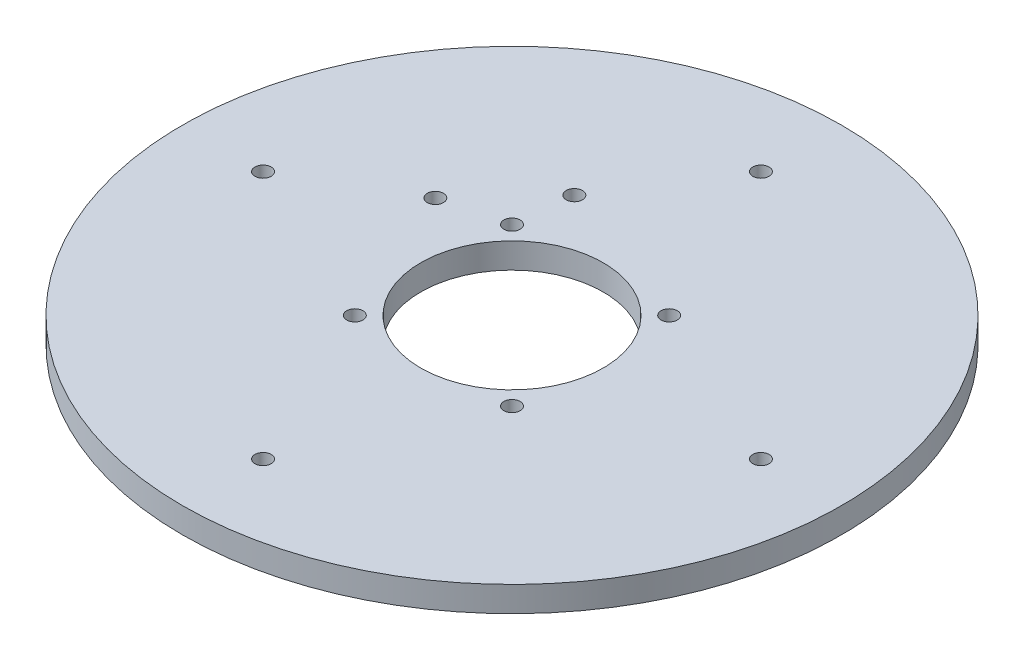
ISO-10303-21;
HEADER;
FILE_DESCRIPTION(('STEP AP214'),'2;1');
FILE_NAME('part.step','',(''),(''),'','','');
FILE_SCHEMA(('AUTOMOTIVE_DESIGN { 1 0 10303 214 1 1 1 1 }'));
ENDSEC;
DATA;
#1=APPLICATION_CONTEXT('core data for automotive mechanical design processes');
#2=APPLICATION_PROTOCOL_DEFINITION('international standard','automotive_design',2000,#1);
#3=PRODUCT_CONTEXT('',#1,'mechanical');
#4=PRODUCT('Part','Part','',(#3));
#5=PRODUCT_RELATED_PRODUCT_CATEGORY('part','',(#4));
#6=PRODUCT_DEFINITION_FORMATION('','',#4);
#7=PRODUCT_DEFINITION_CONTEXT('part definition',#1,'design');
#8=PRODUCT_DEFINITION('design','',#6,#7);
#9=PRODUCT_DEFINITION_SHAPE('','',#8);
#10=(LENGTH_UNIT() NAMED_UNIT(*) SI_UNIT(.MILLI.,.METRE.));
#11=(NAMED_UNIT(*) PLANE_ANGLE_UNIT() SI_UNIT($,.RADIAN.));
#12=(NAMED_UNIT(*) SI_UNIT($,.STERADIAN.) SOLID_ANGLE_UNIT());
#13=UNCERTAINTY_MEASURE_WITH_UNIT(LENGTH_MEASURE(1.E-05),#10,'distance_accuracy_value','');
#14=(GEOMETRIC_REPRESENTATION_CONTEXT(3) GLOBAL_UNCERTAINTY_ASSIGNED_CONTEXT((#13)) GLOBAL_UNIT_ASSIGNED_CONTEXT((#10,
#11,#12)) REPRESENTATION_CONTEXT('',''));
#15=CARTESIAN_POINT('',(0.,0.,0.));
#16=DIRECTION('',(0.,0.,1.));
#17=DIRECTION('',(1.,0.,0.));
#18=AXIS2_PLACEMENT_3D('',#15,#16,#17);
#19=CARTESIAN_POINT('',(0.,5.,0.));
#20=DIRECTION('',(0.,-1.,0.));
#21=DIRECTION('',(0.,0.,-1.));
#22=AXIS2_PLACEMENT_3D('',#19,#20,#21);
#23=PLANE('',#22);
#24=CARTESIAN_POINT('',(-27.6166430453761,5.,-12.496829296618));
#25=DIRECTION('',(0.,1.,0.));
#26=DIRECTION('',(0.,0.,1.));
#27=AXIS2_PLACEMENT_3D('',#24,#25,#26);
#28=CIRCLE('',#27,1.6);
#29=CARTESIAN_POINT('',(-27.6166430453761,5.,-10.896829296618));
#30=VERTEX_POINT('',#29);
#31=EDGE_CURVE('E140',#30,#30,#28,.T.);
#32=ORIENTED_EDGE('',*,*,#31,.F.);
#33=EDGE_LOOP('',(#32));
#34=FACE_BOUND('',#33,.T.);
#35=CARTESIAN_POINT('',(-14.3833569546239,5.,-26.6827427053592));
#36=DIRECTION('',(0.,1.,0.));
#37=DIRECTION('',(0.,0.,1.));
#38=AXIS2_PLACEMENT_3D('',#35,#36,#37);
#39=CIRCLE('',#38,1.6);
#40=CARTESIAN_POINT('',(-14.3833569546239,5.,-25.0827427053592));
#41=VERTEX_POINT('',#40);
#42=EDGE_CURVE('E136',#41,#41,#39,.T.);
#43=ORIENTED_EDGE('',*,*,#42,.F.);
#44=EDGE_LOOP('',(#43));
#45=FACE_BOUND('',#44,.T.);
#46=CARTESIAN_POINT('',(15.5,5.,15.5));
#47=DIRECTION('',(0.,1.,0.));
#48=DIRECTION('',(0.,0.,1.));
#49=AXIS2_PLACEMENT_3D('',#46,#47,#48);
#50=CIRCLE('',#49,1.6);
#51=CARTESIAN_POINT('',(15.5,5.,17.1));
#52=VERTEX_POINT('',#51);
#53=EDGE_CURVE('E72',#52,#52,#50,.T.);
#54=ORIENTED_EDGE('',*,*,#53,.F.);
#55=EDGE_LOOP('',(#54));
#56=FACE_BOUND('',#55,.T.);
#57=CARTESIAN_POINT('',(15.5,5.,-15.5));
#58=DIRECTION('',(0.,1.,0.));
#59=DIRECTION('',(0.,0.,1.));
#60=AXIS2_PLACEMENT_3D('',#57,#58,#59);
#61=CIRCLE('',#60,1.6);
#62=CARTESIAN_POINT('',(15.5,5.,-13.9));
#63=VERTEX_POINT('',#62);
#64=EDGE_CURVE('E81',#63,#63,#61,.T.);
#65=ORIENTED_EDGE('',*,*,#64,.F.);
#66=EDGE_LOOP('',(#65));
#67=FACE_BOUND('',#66,.T.);
#68=CARTESIAN_POINT('',(-15.5,5.,-15.5));
#69=DIRECTION('',(0.,1.,0.));
#70=DIRECTION('',(0.,0.,1.));
#71=AXIS2_PLACEMENT_3D('',#68,#69,#70);
#72=CIRCLE('',#71,1.6);
#73=CARTESIAN_POINT('',(-15.5,5.,-13.9));
#74=VERTEX_POINT('',#73);
#75=EDGE_CURVE('E64',#74,#74,#72,.T.);
#76=ORIENTED_EDGE('',*,*,#75,.F.);
#77=EDGE_LOOP('',(#76));
#78=FACE_BOUND('',#77,.T.);
#79=CARTESIAN_POINT('',(-15.5,5.,15.5));
#80=DIRECTION('',(0.,1.,0.));
#81=DIRECTION('',(0.,0.,1.));
#82=AXIS2_PLACEMENT_3D('',#79,#80,#81);
#83=CIRCLE('',#82,1.6);
#84=CARTESIAN_POINT('',(-15.5,5.,17.1));
#85=VERTEX_POINT('',#84);
#86=EDGE_CURVE('E60',#85,#85,#83,.T.);
#87=ORIENTED_EDGE('',*,*,#86,.F.);
#88=EDGE_LOOP('',(#87));
#89=FACE_BOUND('',#88,.T.);
#90=CARTESIAN_POINT('',(0.,5.,0.));
#91=DIRECTION('',(0.,1.,0.));
#92=DIRECTION('',(0.,0.,1.));
#93=AXIS2_PLACEMENT_3D('',#90,#91,#92);
#94=CIRCLE('',#93,18.);
#95=CARTESIAN_POINT('',(0.,5.,18.));
#96=VERTEX_POINT('',#95);
#97=EDGE_CURVE('E10',#96,#96,#94,.T.);
#98=ORIENTED_EDGE('',*,*,#97,.F.);
#99=EDGE_LOOP('',(#98));
#100=FACE_BOUND('',#99,.T.);
#101=CARTESIAN_POINT('',(-49.1,5.,0.));
#102=DIRECTION('',(0.,1.,0.));
#103=DIRECTION('',(0.,0.,1.));
#104=AXIS2_PLACEMENT_3D('',#101,#102,#103);
#105=CIRCLE('',#104,1.6);
#106=CARTESIAN_POINT('',(-49.1,5.,1.6));
#107=VERTEX_POINT('',#106);
#108=EDGE_CURVE('E109',#107,#107,#105,.T.);
#109=ORIENTED_EDGE('',*,*,#108,.F.);
#110=EDGE_LOOP('',(#109));
#111=FACE_BOUND('',#110,.T.);
#112=CARTESIAN_POINT('',(0.,5.,49.1));
#113=DIRECTION('',(0.,1.,0.));
#114=DIRECTION('',(0.,0.,1.));
#115=AXIS2_PLACEMENT_3D('',#112,#113,#114);
#116=CIRCLE('',#115,1.6);
#117=CARTESIAN_POINT('',(0.,5.,50.7));
#118=VERTEX_POINT('',#117);
#119=EDGE_CURVE('E105',#118,#118,#116,.T.);
#120=ORIENTED_EDGE('',*,*,#119,.F.);
#121=EDGE_LOOP('',(#120));
#122=FACE_BOUND('',#121,.T.);
#123=CARTESIAN_POINT('',(49.1,5.,0.));
#124=DIRECTION('',(0.,1.,0.));
#125=DIRECTION('',(0.,0.,1.));
#126=AXIS2_PLACEMENT_3D('',#123,#124,#125);
#127=CIRCLE('',#126,1.6);
#128=CARTESIAN_POINT('',(49.1,5.,1.6));
#129=VERTEX_POINT('',#128);
#130=EDGE_CURVE('E101',#129,#129,#127,.T.);
#131=ORIENTED_EDGE('',*,*,#130,.F.);
#132=EDGE_LOOP('',(#131));
#133=FACE_BOUND('',#132,.T.);
#134=CARTESIAN_POINT('',(0.,5.,-49.1));
#135=DIRECTION('',(0.,1.,0.));
#136=DIRECTION('',(0.,0.,1.));
#137=AXIS2_PLACEMENT_3D('',#134,#135,#136);
#138=CIRCLE('',#137,1.6);
#139=CARTESIAN_POINT('',(0.,5.,-47.5));
#140=VERTEX_POINT('',#139);
#141=EDGE_CURVE('E97',#140,#140,#138,.T.);
#142=ORIENTED_EDGE('',*,*,#141,.F.);
#143=EDGE_LOOP('',(#142));
#144=FACE_BOUND('',#143,.T.);
#145=CARTESIAN_POINT('',(0.,5.,0.));
#146=DIRECTION('',(0.,1.,0.));
#147=DIRECTION('',(0.,0.,1.));
#148=AXIS2_PLACEMENT_3D('',#145,#146,#147);
#149=CIRCLE('',#148,65.);
#150=CARTESIAN_POINT('',(0.,5.,65.));
#151=VERTEX_POINT('',#150);
#152=EDGE_CURVE('E92',#151,#151,#149,.T.);
#153=ORIENTED_EDGE('',*,*,#152,.T.);
#154=EDGE_LOOP('',(#153));
#155=FACE_BOUND('',#154,.T.);
#156=ADVANCED_FACE('F45',(#34,#45,#56,#67,#78,#89,#100,#111,#122,#133,#144,#155),#23,.F.);
#157=CARTESIAN_POINT('',(0.,0.,0.));
#158=DIRECTION('',(0.,-1.,0.));
#159=DIRECTION('',(0.,0.,-1.));
#160=AXIS2_PLACEMENT_3D('',#157,#158,#159);
#161=PLANE('',#160);
#162=CARTESIAN_POINT('',(-27.6166430453761,0.,-12.496829296618));
#163=DIRECTION('',(0.,1.,0.));
#164=DIRECTION('',(0.,0.,1.));
#165=AXIS2_PLACEMENT_3D('',#162,#163,#164);
#166=CIRCLE('',#165,1.6);
#167=CARTESIAN_POINT('',(-27.6166430453761,0.,-10.896829296618));
#168=VERTEX_POINT('',#167);
#169=EDGE_CURVE('E113',#168,#168,#166,.T.);
#170=ORIENTED_EDGE('',*,*,#169,.T.);
#171=EDGE_LOOP('',(#170));
#172=FACE_BOUND('',#171,.T.);
#173=CARTESIAN_POINT('',(-14.3833569546239,0.,-26.6827427053592));
#174=DIRECTION('',(0.,1.,0.));
#175=DIRECTION('',(0.,0.,1.));
#176=AXIS2_PLACEMENT_3D('',#173,#174,#175);
#177=CIRCLE('',#176,1.6);
#178=CARTESIAN_POINT('',(-14.3833569546239,0.,-25.0827427053592));
#179=VERTEX_POINT('',#178);
#180=EDGE_CURVE('E132',#179,#179,#177,.T.);
#181=ORIENTED_EDGE('',*,*,#180,.T.);
#182=EDGE_LOOP('',(#181));
#183=FACE_BOUND('',#182,.T.);
#184=CARTESIAN_POINT('',(15.5,0.,15.5));
#185=DIRECTION('',(0.,1.,0.));
#186=DIRECTION('',(0.,0.,1.));
#187=AXIS2_PLACEMENT_3D('',#184,#185,#186);
#188=CIRCLE('',#187,1.6);
#189=CARTESIAN_POINT('',(15.5,0.,17.1));
#190=VERTEX_POINT('',#189);
#191=EDGE_CURVE('E68',#190,#190,#188,.T.);
#192=ORIENTED_EDGE('',*,*,#191,.T.);
#193=EDGE_LOOP('',(#192));
#194=FACE_BOUND('',#193,.T.);
#195=CARTESIAN_POINT('',(15.5,0.,-15.5));
#196=DIRECTION('',(0.,1.,0.));
#197=DIRECTION('',(0.,0.,1.));
#198=AXIS2_PLACEMENT_3D('',#195,#196,#197);
#199=CIRCLE('',#198,1.6);
#200=CARTESIAN_POINT('',(15.5,0.,-13.9));
#201=VERTEX_POINT('',#200);
#202=EDGE_CURVE('E77',#201,#201,#199,.T.);
#203=ORIENTED_EDGE('',*,*,#202,.T.);
#204=EDGE_LOOP('',(#203));
#205=FACE_BOUND('',#204,.T.);
#206=CARTESIAN_POINT('',(-15.5,0.,-15.5));
#207=DIRECTION('',(0.,1.,0.));
#208=DIRECTION('',(0.,0.,1.));
#209=AXIS2_PLACEMENT_3D('',#206,#207,#208);
#210=CIRCLE('',#209,1.6);
#211=CARTESIAN_POINT('',(-15.5,0.,-13.9));
#212=VERTEX_POINT('',#211);
#213=EDGE_CURVE('E85',#212,#212,#210,.T.);
#214=ORIENTED_EDGE('',*,*,#213,.T.);
#215=EDGE_LOOP('',(#214));
#216=FACE_BOUND('',#215,.T.);
#217=CARTESIAN_POINT('',(-15.5,0.,15.5));
#218=DIRECTION('',(0.,1.,0.));
#219=DIRECTION('',(0.,0.,1.));
#220=AXIS2_PLACEMENT_3D('',#217,#218,#219);
#221=CIRCLE('',#220,1.6);
#222=CARTESIAN_POINT('',(-15.5,0.,17.1));
#223=VERTEX_POINT('',#222);
#224=EDGE_CURVE('E58',#223,#223,#221,.T.);
#225=ORIENTED_EDGE('',*,*,#224,.T.);
#226=EDGE_LOOP('',(#225));
#227=FACE_BOUND('',#226,.T.);
#228=CARTESIAN_POINT('',(0.,0.,0.));
#229=DIRECTION('',(0.,1.,0.));
#230=DIRECTION('',(0.,0.,1.));
#231=AXIS2_PLACEMENT_3D('',#228,#229,#230);
#232=CIRCLE('',#231,18.);
#233=CARTESIAN_POINT('',(0.,0.,18.));
#234=VERTEX_POINT('',#233);
#235=EDGE_CURVE('E49',#234,#234,#232,.T.);
#236=ORIENTED_EDGE('',*,*,#235,.T.);
#237=EDGE_LOOP('',(#236));
#238=FACE_BOUND('',#237,.T.);
#239=CARTESIAN_POINT('',(-49.1,0.,0.));
#240=DIRECTION('',(0.,1.,0.));
#241=DIRECTION('',(0.,0.,1.));
#242=AXIS2_PLACEMENT_3D('',#239,#240,#241);
#243=CIRCLE('',#242,1.6);
#244=CARTESIAN_POINT('',(-49.1,0.,1.6));
#245=VERTEX_POINT('',#244);
#246=EDGE_CURVE('E96',#245,#245,#243,.T.);
#247=ORIENTED_EDGE('',*,*,#246,.T.);
#248=EDGE_LOOP('',(#247));
#249=FACE_BOUND('',#248,.T.);
#250=CARTESIAN_POINT('',(0.,0.,49.1));
#251=DIRECTION('',(0.,1.,0.));
#252=DIRECTION('',(0.,0.,1.));
#253=AXIS2_PLACEMENT_3D('',#250,#251,#252);
#254=CIRCLE('',#253,1.6);
#255=CARTESIAN_POINT('',(0.,0.,50.7));
#256=VERTEX_POINT('',#255);
#257=EDGE_CURVE('E125',#256,#256,#254,.T.);
#258=ORIENTED_EDGE('',*,*,#257,.T.);
#259=EDGE_LOOP('',(#258));
#260=FACE_BOUND('',#259,.T.);
#261=CARTESIAN_POINT('',(49.1,0.,0.));
#262=DIRECTION('',(0.,1.,0.));
#263=DIRECTION('',(0.,0.,1.));
#264=AXIS2_PLACEMENT_3D('',#261,#262,#263);
#265=CIRCLE('',#264,1.6);
#266=CARTESIAN_POINT('',(49.1,0.,1.6));
#267=VERTEX_POINT('',#266);
#268=EDGE_CURVE('E121',#267,#267,#265,.T.);
#269=ORIENTED_EDGE('',*,*,#268,.T.);
#270=EDGE_LOOP('',(#269));
#271=FACE_BOUND('',#270,.T.);
#272=CARTESIAN_POINT('',(0.,0.,-49.1));
#273=DIRECTION('',(0.,1.,0.));
#274=DIRECTION('',(0.,0.,1.));
#275=AXIS2_PLACEMENT_3D('',#272,#273,#274);
#276=CIRCLE('',#275,1.6);
#277=CARTESIAN_POINT('',(0.,0.,-47.5));
#278=VERTEX_POINT('',#277);
#279=EDGE_CURVE('E117',#278,#278,#276,.T.);
#280=ORIENTED_EDGE('',*,*,#279,.T.);
#281=EDGE_LOOP('',(#280));
#282=FACE_BOUND('',#281,.T.);
#283=CARTESIAN_POINT('',(0.,0.,0.));
#284=DIRECTION('',(0.,1.,0.));
#285=DIRECTION('',(0.,0.,1.));
#286=AXIS2_PLACEMENT_3D('',#283,#284,#285);
#287=CIRCLE('',#286,65.);
#288=CARTESIAN_POINT('',(0.,0.,65.));
#289=VERTEX_POINT('',#288);
#290=EDGE_CURVE('E73',#289,#289,#287,.T.);
#291=ORIENTED_EDGE('',*,*,#290,.F.);
#292=EDGE_LOOP('',(#291));
#293=FACE_BOUND('',#292,.T.);
#294=ADVANCED_FACE('F47',(#172,#183,#194,#205,#216,#227,#238,#249,#260,#271,#282,#293),#161,.T.);
#295=CARTESIAN_POINT('',(0.,5.,0.));
#296=DIRECTION('',(0.,-1.,0.));
#297=DIRECTION('',(0.,0.,-1.));
#298=AXIS2_PLACEMENT_3D('',#295,#296,#297);
#299=CYLINDRICAL_SURFACE('',#298,18.);
#300=ORIENTED_EDGE('',*,*,#97,.T.);
#301=EDGE_LOOP('',(#300));
#302=FACE_BOUND('',#301,.T.);
#303=ORIENTED_EDGE('',*,*,#235,.F.);
#304=EDGE_LOOP('',(#303));
#305=FACE_BOUND('',#304,.T.);
#306=ADVANCED_FACE('F221',(#302,#305),#299,.F.);
#307=CARTESIAN_POINT('',(-15.5,0.,15.5));
#308=DIRECTION('',(0.,1.,0.));
#309=DIRECTION('',(0.,0.,1.));
#310=AXIS2_PLACEMENT_3D('',#307,#308,#309);
#311=CYLINDRICAL_SURFACE('',#310,1.6);
#312=ORIENTED_EDGE('',*,*,#224,.F.);
#313=EDGE_LOOP('',(#312));
#314=FACE_BOUND('',#313,.T.);
#315=ORIENTED_EDGE('',*,*,#86,.T.);
#316=EDGE_LOOP('',(#315));
#317=FACE_BOUND('',#316,.T.);
#318=ADVANCED_FACE('F211',(#314,#317),#311,.F.);
#319=CARTESIAN_POINT('',(-15.5,0.,-15.5));
#320=DIRECTION('',(0.,1.,0.));
#321=DIRECTION('',(0.,0.,1.));
#322=AXIS2_PLACEMENT_3D('',#319,#320,#321);
#323=CYLINDRICAL_SURFACE('',#322,1.6);
#324=ORIENTED_EDGE('',*,*,#213,.F.);
#325=EDGE_LOOP('',(#324));
#326=FACE_BOUND('',#325,.T.);
#327=ORIENTED_EDGE('',*,*,#75,.T.);
#328=EDGE_LOOP('',(#327));
#329=FACE_BOUND('',#328,.T.);
#330=ADVANCED_FACE('F207',(#326,#329),#323,.F.);
#331=CARTESIAN_POINT('',(15.5,0.,-15.5));
#332=DIRECTION('',(0.,1.,0.));
#333=DIRECTION('',(0.,0.,1.));
#334=AXIS2_PLACEMENT_3D('',#331,#332,#333);
#335=CYLINDRICAL_SURFACE('',#334,1.6);
#336=ORIENTED_EDGE('',*,*,#202,.F.);
#337=EDGE_LOOP('',(#336));
#338=FACE_BOUND('',#337,.T.);
#339=ORIENTED_EDGE('',*,*,#64,.T.);
#340=EDGE_LOOP('',(#339));
#341=FACE_BOUND('',#340,.T.);
#342=ADVANCED_FACE('F210',(#338,#341),#335,.F.);
#343=CARTESIAN_POINT('',(15.5,0.,15.5));
#344=DIRECTION('',(0.,1.,0.));
#345=DIRECTION('',(0.,0.,1.));
#346=AXIS2_PLACEMENT_3D('',#343,#344,#345);
#347=CYLINDRICAL_SURFACE('',#346,1.6);
#348=ORIENTED_EDGE('',*,*,#191,.F.);
#349=EDGE_LOOP('',(#348));
#350=FACE_BOUND('',#349,.T.);
#351=ORIENTED_EDGE('',*,*,#53,.T.);
#352=EDGE_LOOP('',(#351));
#353=FACE_BOUND('',#352,.T.);
#354=ADVANCED_FACE('F199',(#350,#353),#347,.F.);
#355=CARTESIAN_POINT('',(0.,0.,-49.1));
#356=DIRECTION('',(0.,1.,0.));
#357=DIRECTION('',(0.,0.,1.));
#358=AXIS2_PLACEMENT_3D('',#355,#356,#357);
#359=CYLINDRICAL_SURFACE('',#358,1.6);
#360=ORIENTED_EDGE('',*,*,#279,.F.);
#361=EDGE_LOOP('',(#360));
#362=FACE_BOUND('',#361,.T.);
#363=ORIENTED_EDGE('',*,*,#141,.T.);
#364=EDGE_LOOP('',(#363));
#365=FACE_BOUND('',#364,.T.);
#366=ADVANCED_FACE('F195',(#362,#365),#359,.F.);
#367=CARTESIAN_POINT('',(49.1,0.,0.));
#368=DIRECTION('',(0.,1.,0.));
#369=DIRECTION('',(0.,0.,1.));
#370=AXIS2_PLACEMENT_3D('',#367,#368,#369);
#371=CYLINDRICAL_SURFACE('',#370,1.6);
#372=ORIENTED_EDGE('',*,*,#268,.F.);
#373=EDGE_LOOP('',(#372));
#374=FACE_BOUND('',#373,.T.);
#375=ORIENTED_EDGE('',*,*,#130,.T.);
#376=EDGE_LOOP('',(#375));
#377=FACE_BOUND('',#376,.T.);
#378=ADVANCED_FACE('F198',(#374,#377),#371,.F.);
#379=CARTESIAN_POINT('',(0.,0.,49.1));
#380=DIRECTION('',(0.,1.,0.));
#381=DIRECTION('',(0.,0.,1.));
#382=AXIS2_PLACEMENT_3D('',#379,#380,#381);
#383=CYLINDRICAL_SURFACE('',#382,1.6);
#384=ORIENTED_EDGE('',*,*,#257,.F.);
#385=EDGE_LOOP('',(#384));
#386=FACE_BOUND('',#385,.T.);
#387=ORIENTED_EDGE('',*,*,#119,.T.);
#388=EDGE_LOOP('',(#387));
#389=FACE_BOUND('',#388,.T.);
#390=ADVANCED_FACE('F191',(#386,#389),#383,.F.);
#391=CARTESIAN_POINT('',(-49.1,0.,0.));
#392=DIRECTION('',(0.,1.,0.));
#393=DIRECTION('',(0.,0.,1.));
#394=AXIS2_PLACEMENT_3D('',#391,#392,#393);
#395=CYLINDRICAL_SURFACE('',#394,1.6);
#396=ORIENTED_EDGE('',*,*,#246,.F.);
#397=EDGE_LOOP('',(#396));
#398=FACE_BOUND('',#397,.T.);
#399=ORIENTED_EDGE('',*,*,#108,.T.);
#400=EDGE_LOOP('',(#399));
#401=FACE_BOUND('',#400,.T.);
#402=ADVANCED_FACE('F182',(#398,#401),#395,.F.);
#403=CARTESIAN_POINT('',(0.,0.,0.));
#404=DIRECTION('',(0.,1.,0.));
#405=DIRECTION('',(0.,0.,1.));
#406=AXIS2_PLACEMENT_3D('',#403,#404,#405);
#407=CYLINDRICAL_SURFACE('',#406,65.);
#408=ORIENTED_EDGE('',*,*,#290,.T.);
#409=EDGE_LOOP('',(#408));
#410=FACE_BOUND('',#409,.T.);
#411=ORIENTED_EDGE('',*,*,#152,.F.);
#412=EDGE_LOOP('',(#411));
#413=FACE_BOUND('',#412,.T.);
#414=ADVANCED_FACE('F180',(#410,#413),#407,.T.);
#415=CARTESIAN_POINT('',(-14.3833569546239,0.,-26.6827427053592));
#416=DIRECTION('',(0.,1.,0.));
#417=DIRECTION('',(0.,0.,1.));
#418=AXIS2_PLACEMENT_3D('',#415,#416,#417);
#419=CYLINDRICAL_SURFACE('',#418,1.6);
#420=ORIENTED_EDGE('',*,*,#180,.F.);
#421=EDGE_LOOP('',(#420));
#422=FACE_BOUND('',#421,.T.);
#423=ORIENTED_EDGE('',*,*,#42,.T.);
#424=EDGE_LOOP('',(#423));
#425=FACE_BOUND('',#424,.T.);
#426=ADVANCED_FACE('F153',(#422,#425),#419,.F.);
#427=CARTESIAN_POINT('',(-27.6166430453761,0.,-12.496829296618));
#428=DIRECTION('',(0.,1.,0.));
#429=DIRECTION('',(0.,0.,1.));
#430=AXIS2_PLACEMENT_3D('',#427,#428,#429);
#431=CYLINDRICAL_SURFACE('',#430,1.6);
#432=ORIENTED_EDGE('',*,*,#169,.F.);
#433=EDGE_LOOP('',(#432));
#434=FACE_BOUND('',#433,.T.);
#435=ORIENTED_EDGE('',*,*,#31,.T.);
#436=EDGE_LOOP('',(#435));
#437=FACE_BOUND('',#436,.T.);
#438=ADVANCED_FACE('F150',(#434,#437),#431,.F.);
#439=CLOSED_SHELL('',(#156,#294,#306,#318,#330,#342,#354,#366,#378,#390,#402,#414,#426,#438));
#440=MANIFOLD_SOLID_BREP('B2',#439);
#441=ADVANCED_BREP_SHAPE_REPRESENTATION('',(#18,#440),#14);
#442=SHAPE_DEFINITION_REPRESENTATION(#9,#441);
ENDSEC;
END-ISO-10303-21;
